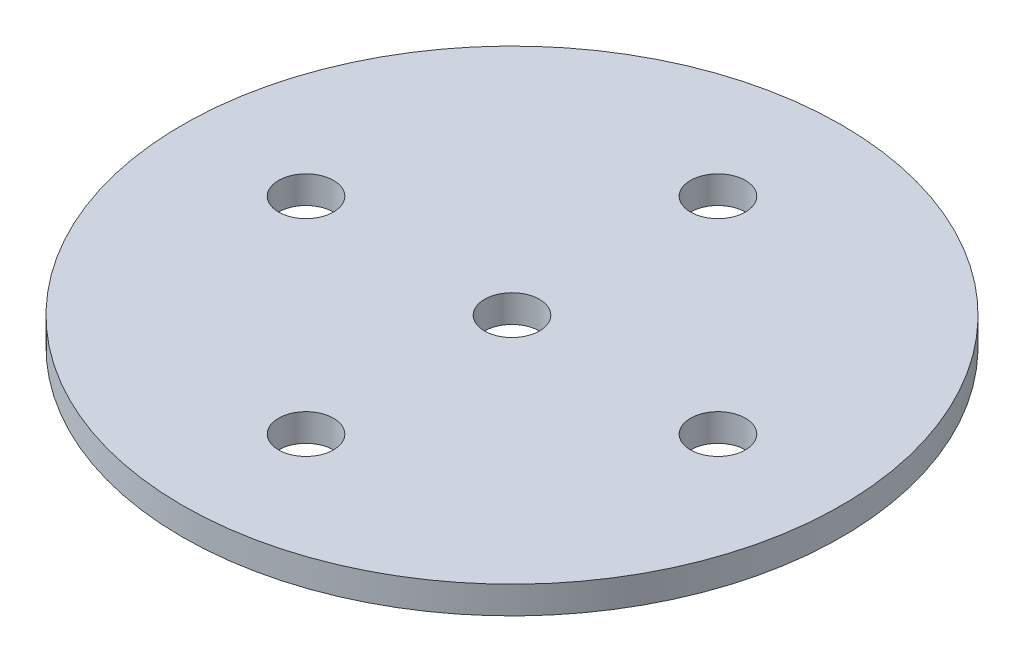
ISO-10303-21;
HEADER;
FILE_DESCRIPTION(('STEP AP214'),'2;1');
FILE_NAME('part.step','',(''),(''),'','','');
FILE_SCHEMA(('AUTOMOTIVE_DESIGN { 1 0 10303 214 1 1 1 1 }'));
ENDSEC;
DATA;
#1=APPLICATION_CONTEXT('core data for automotive mechanical design processes');
#2=APPLICATION_PROTOCOL_DEFINITION('international standard','automotive_design',2000,#1);
#3=PRODUCT_CONTEXT('',#1,'mechanical');
#4=PRODUCT('Part','Part','',(#3));
#5=PRODUCT_RELATED_PRODUCT_CATEGORY('part','',(#4));
#6=PRODUCT_DEFINITION_FORMATION('','',#4);
#7=PRODUCT_DEFINITION_CONTEXT('part definition',#1,'design');
#8=PRODUCT_DEFINITION('design','',#6,#7);
#9=PRODUCT_DEFINITION_SHAPE('','',#8);
#10=(LENGTH_UNIT() NAMED_UNIT(*) SI_UNIT(.MILLI.,.METRE.));
#11=(NAMED_UNIT(*) PLANE_ANGLE_UNIT() SI_UNIT($,.RADIAN.));
#12=(NAMED_UNIT(*) SI_UNIT($,.STERADIAN.) SOLID_ANGLE_UNIT());
#13=UNCERTAINTY_MEASURE_WITH_UNIT(LENGTH_MEASURE(1.E-05),#10,'distance_accuracy_value','');
#14=(GEOMETRIC_REPRESENTATION_CONTEXT(3) GLOBAL_UNCERTAINTY_ASSIGNED_CONTEXT((#13)) GLOBAL_UNIT_ASSIGNED_CONTEXT((#10,
#11,#12)) REPRESENTATION_CONTEXT('',''));
#15=CARTESIAN_POINT('',(0.,0.,0.));
#16=DIRECTION('',(0.,0.,1.));
#17=DIRECTION('',(1.,0.,0.));
#18=AXIS2_PLACEMENT_3D('',#15,#16,#17);
#19=CARTESIAN_POINT('',(0.,10.,0.));
#20=DIRECTION('',(0.,1.,0.));
#21=DIRECTION('',(0.,0.,1.));
#22=AXIS2_PLACEMENT_3D('',#19,#20,#21);
#23=PLANE('',#22);
#24=CARTESIAN_POINT('',(-75.,10.,0.));
#25=DIRECTION('',(0.,1.,0.));
#26=DIRECTION('',(0.,0.,1.));
#27=AXIS2_PLACEMENT_3D('',#24,#25,#26);
#28=CIRCLE('',#27,9.99999999999999);
#29=CARTESIAN_POINT('',(-75.,10.,9.99999999999999));
#30=VERTEX_POINT('',#29);
#31=EDGE_CURVE('E71',#30,#30,#28,.T.);
#32=ORIENTED_EDGE('',*,*,#31,.F.);
#33=EDGE_LOOP('',(#32));
#34=FACE_BOUND('',#33,.T.);
#35=CARTESIAN_POINT('',(75.,10.,0.));
#36=DIRECTION('',(0.,1.,0.));
#37=DIRECTION('',(0.,0.,1.));
#38=AXIS2_PLACEMENT_3D('',#35,#36,#37);
#39=CIRCLE('',#38,9.99999999999999);
#40=CARTESIAN_POINT('',(75.,10.,9.99999999999999));
#41=VERTEX_POINT('',#40);
#42=EDGE_CURVE('E64',#41,#41,#39,.T.);
#43=ORIENTED_EDGE('',*,*,#42,.F.);
#44=EDGE_LOOP('',(#43));
#45=FACE_BOUND('',#44,.T.);
#46=CARTESIAN_POINT('',(0.,10.,0.));
#47=DIRECTION('',(0.,1.,0.));
#48=DIRECTION('',(0.,0.,1.));
#49=AXIS2_PLACEMENT_3D('',#46,#47,#48);
#50=CIRCLE('',#49,120.);
#51=CARTESIAN_POINT('',(0.,10.,120.));
#52=VERTEX_POINT('',#51);
#53=EDGE_CURVE('E11',#52,#52,#50,.T.);
#54=ORIENTED_EDGE('',*,*,#53,.T.);
#55=EDGE_LOOP('',(#54));
#56=FACE_BOUND('',#55,.T.);
#57=CARTESIAN_POINT('',(0.,10.,0.));
#58=DIRECTION('',(0.,1.,0.));
#59=DIRECTION('',(0.,0.,1.));
#60=AXIS2_PLACEMENT_3D('',#57,#58,#59);
#61=CIRCLE('',#60,10.);
#62=CARTESIAN_POINT('',(0.,10.,10.));
#63=VERTEX_POINT('',#62);
#64=EDGE_CURVE('E48',#63,#63,#61,.T.);
#65=ORIENTED_EDGE('',*,*,#64,.F.);
#66=EDGE_LOOP('',(#65));
#67=FACE_BOUND('',#66,.T.);
#68=CARTESIAN_POINT('',(0.,10.,75.));
#69=DIRECTION('',(0.,1.,0.));
#70=DIRECTION('',(0.,0.,1.));
#71=AXIS2_PLACEMENT_3D('',#68,#69,#70);
#72=CIRCLE('',#71,10.);
#73=CARTESIAN_POINT('',(0.,10.,85.));
#74=VERTEX_POINT('',#73);
#75=EDGE_CURVE('E65',#74,#74,#72,.T.);
#76=ORIENTED_EDGE('',*,*,#75,.F.);
#77=EDGE_LOOP('',(#76));
#78=FACE_BOUND('',#77,.T.);
#79=CARTESIAN_POINT('',(0.,10.,-75.));
#80=DIRECTION('',(0.,1.,0.));
#81=DIRECTION('',(0.,0.,1.));
#82=AXIS2_PLACEMENT_3D('',#79,#80,#81);
#83=CIRCLE('',#82,10.);
#84=CARTESIAN_POINT('',(0.,10.,-65.));
#85=VERTEX_POINT('',#84);
#86=EDGE_CURVE('E79',#85,#85,#83,.T.);
#87=ORIENTED_EDGE('',*,*,#86,.F.);
#88=EDGE_LOOP('',(#87));
#89=FACE_BOUND('',#88,.T.);
#90=ADVANCED_FACE('F34',(#34,#45,#56,#67,#78,#89),#23,.T.);
#91=CARTESIAN_POINT('',(0.,0.,0.));
#92=DIRECTION('',(0.,1.,0.));
#93=DIRECTION('',(0.,0.,1.));
#94=AXIS2_PLACEMENT_3D('',#91,#92,#93);
#95=PLANE('',#94);
#96=CARTESIAN_POINT('',(0.,0.,0.));
#97=DIRECTION('',(0.,1.,0.));
#98=DIRECTION('',(0.,0.,1.));
#99=AXIS2_PLACEMENT_3D('',#96,#97,#98);
#100=CIRCLE('',#99,120.);
#101=CARTESIAN_POINT('',(0.,0.,120.));
#102=VERTEX_POINT('',#101);
#103=EDGE_CURVE('E38',#102,#102,#100,.T.);
#104=ORIENTED_EDGE('',*,*,#103,.F.);
#105=EDGE_LOOP('',(#104));
#106=FACE_BOUND('',#105,.T.);
#107=CARTESIAN_POINT('',(0.,0.,0.));
#108=DIRECTION('',(0.,1.,0.));
#109=DIRECTION('',(0.,0.,1.));
#110=AXIS2_PLACEMENT_3D('',#107,#108,#109);
#111=CIRCLE('',#110,10.);
#112=CARTESIAN_POINT('',(0.,0.,10.));
#113=VERTEX_POINT('',#112);
#114=EDGE_CURVE('E51',#113,#113,#111,.T.);
#115=ORIENTED_EDGE('',*,*,#114,.T.);
#116=EDGE_LOOP('',(#115));
#117=FACE_BOUND('',#116,.T.);
#118=CARTESIAN_POINT('',(75.,0.,0.));
#119=DIRECTION('',(0.,1.,0.));
#120=DIRECTION('',(0.,0.,1.));
#121=AXIS2_PLACEMENT_3D('',#118,#119,#120);
#122=CIRCLE('',#121,9.99999999999999);
#123=CARTESIAN_POINT('',(75.,0.,9.99999999999999));
#124=VERTEX_POINT('',#123);
#125=EDGE_CURVE('E62',#124,#124,#122,.T.);
#126=ORIENTED_EDGE('',*,*,#125,.T.);
#127=EDGE_LOOP('',(#126));
#128=FACE_BOUND('',#127,.T.);
#129=CARTESIAN_POINT('',(0.,0.,75.));
#130=DIRECTION('',(0.,1.,0.));
#131=DIRECTION('',(0.,0.,1.));
#132=AXIS2_PLACEMENT_3D('',#129,#130,#131);
#133=CIRCLE('',#132,10.);
#134=CARTESIAN_POINT('',(0.,0.,85.));
#135=VERTEX_POINT('',#134);
#136=EDGE_CURVE('E69',#135,#135,#133,.T.);
#137=ORIENTED_EDGE('',*,*,#136,.T.);
#138=EDGE_LOOP('',(#137));
#139=FACE_BOUND('',#138,.T.);
#140=CARTESIAN_POINT('',(-75.,0.,0.));
#141=DIRECTION('',(0.,1.,0.));
#142=DIRECTION('',(0.,0.,1.));
#143=AXIS2_PLACEMENT_3D('',#140,#141,#142);
#144=CIRCLE('',#143,9.99999999999999);
#145=CARTESIAN_POINT('',(-75.,0.,9.99999999999999));
#146=VERTEX_POINT('',#145);
#147=EDGE_CURVE('E76',#146,#146,#144,.T.);
#148=ORIENTED_EDGE('',*,*,#147,.T.);
#149=EDGE_LOOP('',(#148));
#150=FACE_BOUND('',#149,.T.);
#151=CARTESIAN_POINT('',(0.,0.,-75.));
#152=DIRECTION('',(0.,1.,0.));
#153=DIRECTION('',(0.,0.,1.));
#154=AXIS2_PLACEMENT_3D('',#151,#152,#153);
#155=CIRCLE('',#154,10.);
#156=CARTESIAN_POINT('',(0.,0.,-65.));
#157=VERTEX_POINT('',#156);
#158=EDGE_CURVE('E84',#157,#157,#155,.T.);
#159=ORIENTED_EDGE('',*,*,#158,.T.);
#160=EDGE_LOOP('',(#159));
#161=FACE_BOUND('',#160,.T.);
#162=ADVANCED_FACE('F95',(#106,#117,#128,#139,#150,#161),#95,.F.);
#163=CARTESIAN_POINT('',(0.,10.,0.));
#164=DIRECTION('',(0.,-1.,0.));
#165=DIRECTION('',(0.,0.,-1.));
#166=AXIS2_PLACEMENT_3D('',#163,#164,#165);
#167=CYLINDRICAL_SURFACE('',#166,120.);
#168=ORIENTED_EDGE('',*,*,#53,.F.);
#169=EDGE_LOOP('',(#168));
#170=FACE_BOUND('',#169,.T.);
#171=ORIENTED_EDGE('',*,*,#103,.T.);
#172=EDGE_LOOP('',(#171));
#173=FACE_BOUND('',#172,.T.);
#174=ADVANCED_FACE('F36',(#170,#173),#167,.T.);
#175=CARTESIAN_POINT('',(0.,10.,0.));
#176=DIRECTION('',(0.,-1.,0.));
#177=DIRECTION('',(0.,0.,-1.));
#178=AXIS2_PLACEMENT_3D('',#175,#176,#177);
#179=CYLINDRICAL_SURFACE('',#178,10.);
#180=ORIENTED_EDGE('',*,*,#64,.T.);
#181=EDGE_LOOP('',(#180));
#182=FACE_BOUND('',#181,.T.);
#183=ORIENTED_EDGE('',*,*,#114,.F.);
#184=EDGE_LOOP('',(#183));
#185=FACE_BOUND('',#184,.T.);
#186=ADVANCED_FACE('F105',(#182,#185),#179,.F.);
#187=CARTESIAN_POINT('',(75.,10.,0.));
#188=DIRECTION('',(0.,-1.,0.));
#189=DIRECTION('',(0.,0.,-1.));
#190=AXIS2_PLACEMENT_3D('',#187,#188,#189);
#191=CYLINDRICAL_SURFACE('',#190,9.99999999999999);
#192=ORIENTED_EDGE('',*,*,#42,.T.);
#193=EDGE_LOOP('',(#192));
#194=FACE_BOUND('',#193,.T.);
#195=ORIENTED_EDGE('',*,*,#125,.F.);
#196=EDGE_LOOP('',(#195));
#197=FACE_BOUND('',#196,.T.);
#198=ADVANCED_FACE('F108',(#194,#197),#191,.F.);
#199=CARTESIAN_POINT('',(0.,10.,75.));
#200=DIRECTION('',(0.,-1.,0.));
#201=DIRECTION('',(0.,0.,-1.));
#202=AXIS2_PLACEMENT_3D('',#199,#200,#201);
#203=CYLINDRICAL_SURFACE('',#202,10.);
#204=ORIENTED_EDGE('',*,*,#75,.T.);
#205=EDGE_LOOP('',(#204));
#206=FACE_BOUND('',#205,.T.);
#207=ORIENTED_EDGE('',*,*,#136,.F.);
#208=EDGE_LOOP('',(#207));
#209=FACE_BOUND('',#208,.T.);
#210=ADVANCED_FACE('F112',(#206,#209),#203,.F.);
#211=CARTESIAN_POINT('',(-75.,10.,0.));
#212=DIRECTION('',(0.,-1.,0.));
#213=DIRECTION('',(0.,0.,-1.));
#214=AXIS2_PLACEMENT_3D('',#211,#212,#213);
#215=CYLINDRICAL_SURFACE('',#214,9.99999999999999);
#216=ORIENTED_EDGE('',*,*,#31,.T.);
#217=EDGE_LOOP('',(#216));
#218=FACE_BOUND('',#217,.T.);
#219=ORIENTED_EDGE('',*,*,#147,.F.);
#220=EDGE_LOOP('',(#219));
#221=FACE_BOUND('',#220,.T.);
#222=ADVANCED_FACE('F116',(#218,#221),#215,.F.);
#223=CARTESIAN_POINT('',(0.,10.,-75.));
#224=DIRECTION('',(0.,-1.,0.));
#225=DIRECTION('',(0.,0.,-1.));
#226=AXIS2_PLACEMENT_3D('',#223,#224,#225);
#227=CYLINDRICAL_SURFACE('',#226,10.);
#228=ORIENTED_EDGE('',*,*,#86,.T.);
#229=EDGE_LOOP('',(#228));
#230=FACE_BOUND('',#229,.T.);
#231=ORIENTED_EDGE('',*,*,#158,.F.);
#232=EDGE_LOOP('',(#231));
#233=FACE_BOUND('',#232,.T.);
#234=ADVANCED_FACE('F91',(#230,#233),#227,.F.);
#235=CLOSED_SHELL('',(#90,#162,#174,#186,#198,#210,#222,#234));
#236=MANIFOLD_SOLID_BREP('B2',#235);
#237=ADVANCED_BREP_SHAPE_REPRESENTATION('',(#18,#236),#14);
#238=SHAPE_DEFINITION_REPRESENTATION(#9,#237);
ENDSEC;
END-ISO-10303-21;
